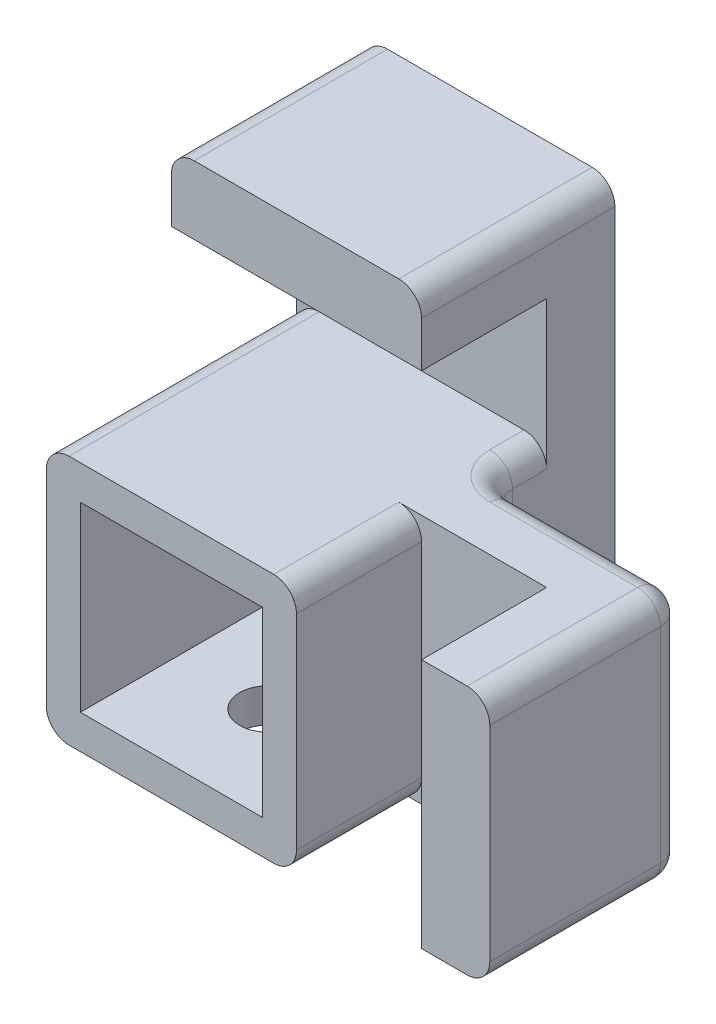
ISO-10303-21;
HEADER;
FILE_DESCRIPTION(('STEP AP214'),'2;1');
FILE_NAME('part.step','',(''),(''),'','','');
FILE_SCHEMA(('AUTOMOTIVE_DESIGN { 1 0 10303 214 1 1 1 1 }'));
ENDSEC;
DATA;
#1=APPLICATION_CONTEXT('core data for automotive mechanical design processes');
#2=APPLICATION_PROTOCOL_DEFINITION('international standard','automotive_design',2000,#1);
#3=PRODUCT_CONTEXT('',#1,'mechanical');
#4=PRODUCT('Part','Part','',(#3));
#5=PRODUCT_RELATED_PRODUCT_CATEGORY('part','',(#4));
#6=PRODUCT_DEFINITION_FORMATION('','',#4);
#7=PRODUCT_DEFINITION_CONTEXT('part definition',#1,'design');
#8=PRODUCT_DEFINITION('design','',#6,#7);
#9=PRODUCT_DEFINITION_SHAPE('','',#8);
#10=(LENGTH_UNIT() NAMED_UNIT(*) SI_UNIT(.MILLI.,.METRE.));
#11=(NAMED_UNIT(*) PLANE_ANGLE_UNIT() SI_UNIT($,.RADIAN.));
#12=(NAMED_UNIT(*) SI_UNIT($,.STERADIAN.) SOLID_ANGLE_UNIT());
#13=UNCERTAINTY_MEASURE_WITH_UNIT(LENGTH_MEASURE(1.E-05),#10,'distance_accuracy_value','');
#14=(GEOMETRIC_REPRESENTATION_CONTEXT(3) GLOBAL_UNCERTAINTY_ASSIGNED_CONTEXT((#13)) GLOBAL_UNIT_ASSIGNED_CONTEXT((#10,
#11,#12)) REPRESENTATION_CONTEXT('',''));
#15=CARTESIAN_POINT('',(0.,0.,0.));
#16=DIRECTION('',(0.,0.,1.));
#17=DIRECTION('',(1.,0.,0.));
#18=AXIS2_PLACEMENT_3D('',#15,#16,#17);
#19=CARTESIAN_POINT('',(-3.,19.,28.));
#20=DIRECTION('',(0.,-1.,0.));
#21=DIRECTION('',(0.,0.,-1.));
#22=AXIS2_PLACEMENT_3D('',#19,#20,#21);
#23=PLANE('',#22);
#24=DIRECTION('',(1.,0.,0.));
#25=VECTOR('',#24,1.);
#26=CARTESIAN_POINT('',(17.,19.,13.));
#27=LINE('',#26,#25);
#28=CARTESIAN_POINT('',(34.,19.,13.));
#29=VERTEX_POINT('',#28);
#30=CARTESIAN_POINT('',(21.,19.,13.));
#31=VERTEX_POINT('',#30);
#32=EDGE_CURVE('E452',#29,#31,#27,.F.);
#33=ORIENTED_EDGE('',*,*,#32,.T.);
#34=CARTESIAN_POINT('',(21.,19.,9.));
#35=DIRECTION('',(0.,-1.,0.));
#36=DIRECTION('',(0.,0.,-1.));
#37=AXIS2_PLACEMENT_3D('',#34,#35,#36);
#38=CIRCLE('',#37,4.);
#39=CARTESIAN_POINT('',(17.,19.,9.));
#40=VERTEX_POINT('',#39);
#41=EDGE_CURVE('E44',#31,#40,#38,.T.);
#42=ORIENTED_EDGE('',*,*,#41,.T.);
#43=DIRECTION('',(0.,0.,-1.));
#44=VECTOR('',#43,1.);
#45=CARTESIAN_POINT('',(17.,19.,28.));
#46=LINE('',#45,#44);
#47=CARTESIAN_POINT('',(17.,19.,6.));
#48=VERTEX_POINT('',#47);
#49=EDGE_CURVE('E386',#40,#48,#46,.T.);
#50=ORIENTED_EDGE('',*,*,#49,.T.);
#51=DIRECTION('',(1.,0.,0.));
#52=VECTOR('',#51,1.);
#53=CARTESIAN_POINT('',(-3.,19.,6.));
#54=LINE('',#53,#52);
#55=CARTESIAN_POINT('',(-1.,19.,6.));
#56=VERTEX_POINT('',#55);
#57=EDGE_CURVE('E277',#56,#48,#54,.T.);
#58=ORIENTED_EDGE('',*,*,#57,.F.);
#59=DIRECTION('',(0.,0.,-1.));
#60=VECTOR('',#59,1.);
#61=CARTESIAN_POINT('',(-1.,19.,28.));
#62=LINE('',#61,#60);
#63=CARTESIAN_POINT('',(-1.,19.,28.));
#64=VERTEX_POINT('',#63);
#65=EDGE_CURVE('E381',#56,#64,#62,.F.);
#66=ORIENTED_EDGE('',*,*,#65,.T.);
#67=DIRECTION('',(-1.,0.,0.));
#68=VECTOR('',#67,1.);
#69=CARTESIAN_POINT('',(-3.,19.,28.));
#70=LINE('',#69,#68);
#71=CARTESIAN_POINT('',(17.,19.,28.));
#72=VERTEX_POINT('',#71);
#73=EDGE_CURVE('E352',#72,#64,#70,.T.);
#74=ORIENTED_EDGE('',*,*,#73,.F.);
#75=DIRECTION('',(0.,0.,-1.));
#76=VECTOR('',#75,1.);
#77=CARTESIAN_POINT('',(17.,19.,28.));
#78=LINE('',#77,#76);
#79=CARTESIAN_POINT('',(17.,19.,17.));
#80=VERTEX_POINT('',#79);
#81=EDGE_CURVE('E383',#72,#80,#78,.T.);
#82=ORIENTED_EDGE('',*,*,#81,.T.);
#83=DIRECTION('',(-1.,0.,0.));
#84=VECTOR('',#83,1.);
#85=CARTESIAN_POINT('',(30.,19.,17.));
#86=LINE('',#85,#84);
#87=CARTESIAN_POINT('',(30.,19.,17.));
#88=VERTEX_POINT('',#87);
#89=EDGE_CURVE('E292',#88,#80,#86,.T.);
#90=ORIENTED_EDGE('',*,*,#89,.F.);
#91=DIRECTION('',(0.,0.,-1.));
#92=VECTOR('',#91,1.);
#93=CARTESIAN_POINT('',(30.,19.,28.));
#94=LINE('',#93,#92);
#95=CARTESIAN_POINT('',(30.,19.,28.));
#96=VERTEX_POINT('',#95);
#97=EDGE_CURVE('E288',#96,#88,#94,.T.);
#98=ORIENTED_EDGE('',*,*,#97,.F.);
#99=DIRECTION('',(-1.,0.,0.));
#100=VECTOR('',#99,1.);
#101=CARTESIAN_POINT('',(36.,19.,28.));
#102=LINE('',#101,#100);
#103=CARTESIAN_POINT('',(34.,19.,28.));
#104=VERTEX_POINT('',#103);
#105=EDGE_CURVE('E286',#104,#96,#102,.T.);
#106=ORIENTED_EDGE('',*,*,#105,.F.);
#107=DIRECTION('',(0.,0.,1.));
#108=VECTOR('',#107,1.);
#109=CARTESIAN_POINT('',(34.,19.,11.));
#110=LINE('',#109,#108);
#111=EDGE_CURVE('E388',#104,#29,#110,.F.);
#112=ORIENTED_EDGE('',*,*,#111,.T.);
#113=EDGE_LOOP('',(#33,#42,#50,#58,#66,#74,#82,#90,#98,#106,#112));
#114=FACE_BOUND('',#113,.T.);
#115=ADVANCED_FACE('F35',(#114),#23,.F.);
#116=CARTESIAN_POINT('',(19.,19.,28.));
#117=DIRECTION('',(-1.,0.,0.));
#118=DIRECTION('',(0.,-1.,0.));
#119=AXIS2_PLACEMENT_3D('',#116,#117,#118);
#120=PLANE('',#119);
#121=DIRECTION('',(0.,-1.,0.));
#122=VECTOR('',#121,1.);
#123=CARTESIAN_POINT('',(19.,19.,17.));
#124=LINE('',#123,#122);
#125=CARTESIAN_POINT('',(19.,17.,17.));
#126=VERTEX_POINT('',#125);
#127=CARTESIAN_POINT('',(19.,-0.999999999999997,17.));
#128=VERTEX_POINT('',#127);
#129=EDGE_CURVE('E300',#126,#128,#124,.T.);
#130=ORIENTED_EDGE('',*,*,#129,.F.);
#131=DIRECTION('',(0.,0.,-1.));
#132=VECTOR('',#131,1.);
#133=CARTESIAN_POINT('',(19.,17.,28.));
#134=LINE('',#133,#132);
#135=CARTESIAN_POINT('',(19.,17.,28.));
#136=VERTEX_POINT('',#135);
#137=EDGE_CURVE('E423',#126,#136,#134,.F.);
#138=ORIENTED_EDGE('',*,*,#137,.T.);
#139=DIRECTION('',(0.,1.,0.));
#140=VECTOR('',#139,1.);
#141=CARTESIAN_POINT('',(19.,19.,28.));
#142=LINE('',#141,#140);
#143=CARTESIAN_POINT('',(19.,-0.999999999999997,28.));
#144=VERTEX_POINT('',#143);
#145=EDGE_CURVE('E349',#144,#136,#142,.T.);
#146=ORIENTED_EDGE('',*,*,#145,.F.);
#147=DIRECTION('',(0.,0.,-1.));
#148=VECTOR('',#147,1.);
#149=CARTESIAN_POINT('',(19.,-0.999999999999997,28.));
#150=LINE('',#149,#148);
#151=EDGE_CURVE('E420',#144,#128,#150,.T.);
#152=ORIENTED_EDGE('',*,*,#151,.T.);
#153=EDGE_LOOP('',(#130,#138,#146,#152));
#154=FACE_BOUND('',#153,.T.);
#155=ADVANCED_FACE('F526',(#154),#120,.F.);
#156=CARTESIAN_POINT('',(0.,0.,28.));
#157=DIRECTION('',(0.,0.,1.));
#158=DIRECTION('',(1.,0.,0.));
#159=AXIS2_PLACEMENT_3D('',#156,#157,#158);
#160=PLANE('',#159);
#161=ORIENTED_EDGE('',*,*,#145,.T.);
#162=CARTESIAN_POINT('',(17.,17.,28.));
#163=DIRECTION('',(0.,0.,1.));
#164=DIRECTION('',(1.,0.,0.));
#165=AXIS2_PLACEMENT_3D('',#162,#163,#164);
#166=CIRCLE('',#165,2.);
#167=EDGE_CURVE('E431',#136,#72,#166,.T.);
#168=ORIENTED_EDGE('',*,*,#167,.T.);
#169=ORIENTED_EDGE('',*,*,#73,.T.);
#170=CARTESIAN_POINT('',(-1.,17.,28.));
#171=DIRECTION('',(0.,0.,1.));
#172=DIRECTION('',(1.,0.,0.));
#173=AXIS2_PLACEMENT_3D('',#170,#171,#172);
#174=CIRCLE('',#173,2.);
#175=CARTESIAN_POINT('',(-3.,17.,28.));
#176=VERTEX_POINT('',#175);
#177=EDGE_CURVE('E427',#64,#176,#174,.T.);
#178=ORIENTED_EDGE('',*,*,#177,.T.);
#179=DIRECTION('',(0.,-1.,0.));
#180=VECTOR('',#179,1.);
#181=CARTESIAN_POINT('',(-3.,19.,28.));
#182=LINE('',#181,#180);
#183=CARTESIAN_POINT('',(-3.00000000000001,-0.999999999999997,28.));
#184=VERTEX_POINT('',#183);
#185=EDGE_CURVE('E342',#176,#184,#182,.T.);
#186=ORIENTED_EDGE('',*,*,#185,.T.);
#187=CARTESIAN_POINT('',(-1.00000000000001,-0.999999999999999,28.));
#188=DIRECTION('',(0.,0.,1.));
#189=DIRECTION('',(1.,0.,0.));
#190=AXIS2_PLACEMENT_3D('',#187,#188,#189);
#191=CIRCLE('',#190,2.);
#192=CARTESIAN_POINT('',(-1.00000000000001,-3.,28.));
#193=VERTEX_POINT('',#192);
#194=EDGE_CURVE('E425',#184,#193,#191,.T.);
#195=ORIENTED_EDGE('',*,*,#194,.T.);
#196=DIRECTION('',(1.,0.,0.));
#197=VECTOR('',#196,1.);
#198=CARTESIAN_POINT('',(-3.00000000000001,-3.,28.));
#199=LINE('',#198,#197);
#200=CARTESIAN_POINT('',(17.,-3.,28.));
#201=VERTEX_POINT('',#200);
#202=EDGE_CURVE('E345',#193,#201,#199,.T.);
#203=ORIENTED_EDGE('',*,*,#202,.T.);
#204=CARTESIAN_POINT('',(17.,-0.999999999999997,28.));
#205=DIRECTION('',(0.,0.,1.));
#206=DIRECTION('',(1.,0.,0.));
#207=AXIS2_PLACEMENT_3D('',#204,#205,#206);
#208=CIRCLE('',#207,2.);
#209=EDGE_CURVE('E429',#201,#144,#208,.T.);
#210=ORIENTED_EDGE('',*,*,#209,.T.);
#211=EDGE_LOOP('',(#161,#168,#169,#178,#186,#195,#203,#210));
#212=FACE_BOUND('',#211,.T.);
#213=DIRECTION('',(1.,0.,0.));
#214=VECTOR('',#213,1.);
#215=CARTESIAN_POINT('',(0.,0.,28.));
#216=LINE('',#215,#214);
#217=CARTESIAN_POINT('',(0.,0.,28.));
#218=VERTEX_POINT('',#217);
#219=CARTESIAN_POINT('',(16.,0.,28.));
#220=VERTEX_POINT('',#219);
#221=EDGE_CURVE('E313',#218,#220,#216,.T.);
#222=ORIENTED_EDGE('',*,*,#221,.F.);
#223=DIRECTION('',(0.,-1.,0.));
#224=VECTOR('',#223,1.);
#225=CARTESIAN_POINT('',(0.,0.,28.));
#226=LINE('',#225,#224);
#227=CARTESIAN_POINT('',(0.,16.,28.));
#228=VERTEX_POINT('',#227);
#229=EDGE_CURVE('E311',#228,#218,#226,.T.);
#230=ORIENTED_EDGE('',*,*,#229,.F.);
#231=DIRECTION('',(-1.,0.,0.));
#232=VECTOR('',#231,1.);
#233=CARTESIAN_POINT('',(0.,16.,28.));
#234=LINE('',#233,#232);
#235=CARTESIAN_POINT('',(16.,16.,28.));
#236=VERTEX_POINT('',#235);
#237=EDGE_CURVE('E319',#236,#228,#234,.T.);
#238=ORIENTED_EDGE('',*,*,#237,.F.);
#239=DIRECTION('',(0.,1.,0.));
#240=VECTOR('',#239,1.);
#241=CARTESIAN_POINT('',(16.,0.,28.));
#242=LINE('',#241,#240);
#243=EDGE_CURVE('E316',#220,#236,#242,.T.);
#244=ORIENTED_EDGE('',*,*,#243,.F.);
#245=EDGE_LOOP('',(#222,#230,#238,#244));
#246=FACE_BOUND('',#245,.T.);
#247=ADVANCED_FACE('F521',(#212,#246),#160,.T.);
#248=CARTESIAN_POINT('',(0.,0.,0.));
#249=DIRECTION('',(0.,0.,1.));
#250=DIRECTION('',(1.,0.,0.));
#251=AXIS2_PLACEMENT_3D('',#248,#249,#250);
#252=PLANE('',#251);
#253=DIRECTION('',(1.,0.,0.));
#254=VECTOR('',#253,1.);
#255=CARTESIAN_POINT('',(-3.,36.,0.));
#256=LINE('',#255,#254);
#257=CARTESIAN_POINT('',(-0.999999999999997,36.,0.));
#258=VERTEX_POINT('',#257);
#259=CARTESIAN_POINT('',(17.,36.,0.));
#260=VERTEX_POINT('',#259);
#261=EDGE_CURVE('E268',#258,#260,#256,.T.);
#262=ORIENTED_EDGE('',*,*,#261,.T.);
#263=CARTESIAN_POINT('',(17.,34.,0.));
#264=DIRECTION('',(0.,0.,1.));
#265=DIRECTION('',(1.,0.,0.));
#266=AXIS2_PLACEMENT_3D('',#263,#264,#265);
#267=CIRCLE('',#266,2.);
#268=CARTESIAN_POINT('',(19.,34.,0.));
#269=VERTEX_POINT('',#268);
#270=EDGE_CURVE('E412',#260,#269,#267,.F.);
#271=ORIENTED_EDGE('',*,*,#270,.T.);
#272=DIRECTION('',(0.,1.,0.));
#273=VECTOR('',#272,1.);
#274=CARTESIAN_POINT('',(19.,19.,0.));
#275=LINE('',#274,#273);
#276=CARTESIAN_POINT('',(19.,-0.999999999999997,0.));
#277=VERTEX_POINT('',#276);
#278=EDGE_CURVE('E346',#277,#269,#275,.T.);
#279=ORIENTED_EDGE('',*,*,#278,.F.);
#280=CARTESIAN_POINT('',(17.,-0.999999999999997,0.));
#281=DIRECTION('',(0.,0.,1.));
#282=DIRECTION('',(1.,0.,0.));
#283=AXIS2_PLACEMENT_3D('',#280,#281,#282);
#284=CIRCLE('',#283,2.);
#285=CARTESIAN_POINT('',(17.,-3.,0.));
#286=VERTEX_POINT('',#285);
#287=EDGE_CURVE('E408',#277,#286,#284,.F.);
#288=ORIENTED_EDGE('',*,*,#287,.T.);
#289=DIRECTION('',(1.,0.,0.));
#290=VECTOR('',#289,1.);
#291=CARTESIAN_POINT('',(-3.00000000000001,-3.,0.));
#292=LINE('',#291,#290);
#293=CARTESIAN_POINT('',(-1.00000000000001,-3.,0.));
#294=VERTEX_POINT('',#293);
#295=EDGE_CURVE('E358',#294,#286,#292,.T.);
#296=ORIENTED_EDGE('',*,*,#295,.F.);
#297=CARTESIAN_POINT('',(-1.00000000000001,-0.999999999999999,0.));
#298=DIRECTION('',(0.,0.,1.));
#299=DIRECTION('',(1.,0.,0.));
#300=AXIS2_PLACEMENT_3D('',#297,#298,#299);
#301=CIRCLE('',#300,2.);
#302=CARTESIAN_POINT('',(-3.00000000000001,-0.999999999999997,0.));
#303=VERTEX_POINT('',#302);
#304=EDGE_CURVE('E406',#294,#303,#301,.F.);
#305=ORIENTED_EDGE('',*,*,#304,.T.);
#306=DIRECTION('',(0.,-1.,0.));
#307=VECTOR('',#306,1.);
#308=CARTESIAN_POINT('',(-3.,19.,0.));
#309=LINE('',#308,#307);
#310=CARTESIAN_POINT('',(-3.,34.,0.));
#311=VERTEX_POINT('',#310);
#312=EDGE_CURVE('E341',#311,#303,#309,.T.);
#313=ORIENTED_EDGE('',*,*,#312,.F.);
#314=CARTESIAN_POINT('',(-0.999999999999998,34.,0.));
#315=DIRECTION('',(0.,0.,1.));
#316=DIRECTION('',(1.,0.,0.));
#317=AXIS2_PLACEMENT_3D('',#314,#315,#316);
#318=CIRCLE('',#317,2.);
#319=EDGE_CURVE('E410',#311,#258,#318,.F.);
#320=ORIENTED_EDGE('',*,*,#319,.T.);
#321=EDGE_LOOP('',(#262,#271,#279,#288,#296,#305,#313,#320));
#322=FACE_BOUND('',#321,.T.);
#323=DIRECTION('',(0.,-1.,0.));
#324=VECTOR('',#323,1.);
#325=CARTESIAN_POINT('',(0.,0.,0.));
#326=LINE('',#325,#324);
#327=CARTESIAN_POINT('',(0.,16.,0.));
#328=VERTEX_POINT('',#327);
#329=CARTESIAN_POINT('',(0.,0.,0.));
#330=VERTEX_POINT('',#329);
#331=EDGE_CURVE('E303',#328,#330,#326,.T.);
#332=ORIENTED_EDGE('',*,*,#331,.T.);
#333=DIRECTION('',(1.,0.,0.));
#334=VECTOR('',#333,1.);
#335=CARTESIAN_POINT('',(0.,0.,0.));
#336=LINE('',#335,#334);
#337=CARTESIAN_POINT('',(16.,0.,0.));
#338=VERTEX_POINT('',#337);
#339=EDGE_CURVE('E324',#330,#338,#336,.T.);
#340=ORIENTED_EDGE('',*,*,#339,.T.);
#341=DIRECTION('',(0.,1.,0.));
#342=VECTOR('',#341,1.);
#343=CARTESIAN_POINT('',(16.,0.,0.));
#344=LINE('',#343,#342);
#345=CARTESIAN_POINT('',(16.,16.,0.));
#346=VERTEX_POINT('',#345);
#347=EDGE_CURVE('E327',#338,#346,#344,.T.);
#348=ORIENTED_EDGE('',*,*,#347,.T.);
#349=DIRECTION('',(-1.,0.,0.));
#350=VECTOR('',#349,1.);
#351=CARTESIAN_POINT('',(0.,16.,0.));
#352=LINE('',#351,#350);
#353=EDGE_CURVE('E314',#346,#328,#352,.T.);
#354=ORIENTED_EDGE('',*,*,#353,.T.);
#355=EDGE_LOOP('',(#332,#340,#348,#354));
#356=FACE_BOUND('',#355,.T.);
#357=ADVANCED_FACE('F512',(#322,#356),#252,.F.);
#358=CARTESIAN_POINT('',(-3.,19.,28.));
#359=DIRECTION('',(1.,0.,0.));
#360=DIRECTION('',(0.,1.,0.));
#361=AXIS2_PLACEMENT_3D('',#358,#359,#360);
#362=PLANE('',#361);
#363=CARTESIAN_POINT('',(-3.00000000000001,8.00000000000001,5.5));
#364=DIRECTION('',(-1.,0.,0.));
#365=DIRECTION('',(0.,-1.,0.));
#366=AXIS2_PLACEMENT_3D('',#363,#364,#365);
#367=CIRCLE('',#366,2.5);
#368=CARTESIAN_POINT('',(-3.00000000000001,5.50000000000001,5.5));
#369=VERTEX_POINT('',#368);
#370=EDGE_CURVE('E274',#369,#369,#367,.T.);
#371=ORIENTED_EDGE('',*,*,#370,.F.);
#372=EDGE_LOOP('',(#371));
#373=FACE_BOUND('',#372,.T.);
#374=DIRECTION('',(0.,-1.,0.));
#375=VECTOR('',#374,1.);
#376=CARTESIAN_POINT('',(-3.,30.,17.));
#377=LINE('',#376,#375);
#378=CARTESIAN_POINT('',(-3.,34.,17.));
#379=VERTEX_POINT('',#378);
#380=CARTESIAN_POINT('',(-3.,30.,17.));
#381=VERTEX_POINT('',#380);
#382=EDGE_CURVE('E241',#379,#381,#377,.T.);
#383=ORIENTED_EDGE('',*,*,#382,.F.);
#384=DIRECTION('',(0.,0.,1.));
#385=VECTOR('',#384,1.);
#386=CARTESIAN_POINT('',(-3.,34.,0.));
#387=LINE('',#386,#385);
#388=EDGE_CURVE('E418',#379,#311,#387,.F.);
#389=ORIENTED_EDGE('',*,*,#388,.T.);
#390=ORIENTED_EDGE('',*,*,#312,.T.);
#391=DIRECTION('',(0.,0.,-1.));
#392=VECTOR('',#391,1.);
#393=CARTESIAN_POINT('',(-3.00000000000001,-0.999999999999997,28.));
#394=LINE('',#393,#392);
#395=EDGE_CURVE('E414',#303,#184,#394,.F.);
#396=ORIENTED_EDGE('',*,*,#395,.T.);
#397=ORIENTED_EDGE('',*,*,#185,.F.);
#398=DIRECTION('',(0.,0.,-1.));
#399=VECTOR('',#398,1.);
#400=CARTESIAN_POINT('',(-3.,17.,28.));
#401=LINE('',#400,#399);
#402=CARTESIAN_POINT('',(-3.,17.,6.));
#403=VERTEX_POINT('',#402);
#404=EDGE_CURVE('E416',#176,#403,#401,.T.);
#405=ORIENTED_EDGE('',*,*,#404,.T.);
#406=DIRECTION('',(0.,-1.,0.));
#407=VECTOR('',#406,1.);
#408=CARTESIAN_POINT('',(-3.,19.,6.));
#409=LINE('',#408,#407);
#410=CARTESIAN_POINT('',(-3.,30.,6.));
#411=VERTEX_POINT('',#410);
#412=EDGE_CURVE('E266',#411,#403,#409,.T.);
#413=ORIENTED_EDGE('',*,*,#412,.F.);
#414=DIRECTION('',(0.,0.,-1.));
#415=VECTOR('',#414,1.);
#416=CARTESIAN_POINT('',(-3.,30.,6.));
#417=LINE('',#416,#415);
#418=EDGE_CURVE('E252',#381,#411,#417,.T.);
#419=ORIENTED_EDGE('',*,*,#418,.F.);
#420=EDGE_LOOP('',(#383,#389,#390,#396,#397,#405,#413,#419));
#421=FACE_BOUND('',#420,.T.);
#422=ADVANCED_FACE('F264',(#373,#421),#362,.F.);
#423=CARTESIAN_POINT('',(-3.00000000000001,-3.,28.));
#424=DIRECTION('',(0.,1.,0.));
#425=DIRECTION('',(0.,0.,1.));
#426=AXIS2_PLACEMENT_3D('',#423,#424,#425);
#427=PLANE('',#426);
#428=CARTESIAN_POINT('',(8.,-3.,19.5));
#429=DIRECTION('',(0.,-1.,0.));
#430=DIRECTION('',(0.,0.,-1.));
#431=AXIS2_PLACEMENT_3D('',#428,#429,#430);
#432=CIRCLE('',#431,2.5);
#433=CARTESIAN_POINT('',(8.,-3.,17.));
#434=VERTEX_POINT('',#433);
#435=EDGE_CURVE('E496',#434,#434,#432,.T.);
#436=ORIENTED_EDGE('',*,*,#435,.F.);
#437=EDGE_LOOP('',(#436));
#438=FACE_BOUND('',#437,.T.);
#439=DIRECTION('',(0.,0.,-1.));
#440=VECTOR('',#439,1.);
#441=CARTESIAN_POINT('',(17.,-3.,28.));
#442=LINE('',#441,#440);
#443=CARTESIAN_POINT('',(17.,-3.,9.));
#444=VERTEX_POINT('',#443);
#445=EDGE_CURVE('E365',#286,#444,#442,.F.);
#446=ORIENTED_EDGE('',*,*,#445,.T.);
#447=CARTESIAN_POINT('',(21.,-3.,9.));
#448=DIRECTION('',(0.,1.,0.));
#449=DIRECTION('',(0.,0.,1.));
#450=AXIS2_PLACEMENT_3D('',#447,#448,#449);
#451=CIRCLE('',#450,4.);
#452=CARTESIAN_POINT('',(21.,-3.,13.));
#453=VERTEX_POINT('',#452);
#454=EDGE_CURVE('E11',#444,#453,#451,.T.);
#455=ORIENTED_EDGE('',*,*,#454,.T.);
#456=DIRECTION('',(1.,0.,0.));
#457=VECTOR('',#456,1.);
#458=CARTESIAN_POINT('',(34.,-3.,13.));
#459=LINE('',#458,#457);
#460=CARTESIAN_POINT('',(34.,-3.,13.));
#461=VERTEX_POINT('',#460);
#462=EDGE_CURVE('E457',#453,#461,#459,.T.);
#463=ORIENTED_EDGE('',*,*,#462,.T.);
#464=DIRECTION('',(0.,0.,1.));
#465=VECTOR('',#464,1.);
#466=CARTESIAN_POINT('',(34.,-3.,28.));
#467=LINE('',#466,#465);
#468=CARTESIAN_POINT('',(34.,-3.,28.));
#469=VERTEX_POINT('',#468);
#470=EDGE_CURVE('E370',#461,#469,#467,.T.);
#471=ORIENTED_EDGE('',*,*,#470,.T.);
#472=DIRECTION('',(-1.,0.,0.));
#473=VECTOR('',#472,1.);
#474=CARTESIAN_POINT('',(36.,-3.,28.));
#475=LINE('',#474,#473);
#476=CARTESIAN_POINT('',(30.,-3.,28.));
#477=VERTEX_POINT('',#476);
#478=EDGE_CURVE('E280',#469,#477,#475,.T.);
#479=ORIENTED_EDGE('',*,*,#478,.T.);
#480=DIRECTION('',(0.,0.,-1.));
#481=VECTOR('',#480,1.);
#482=CARTESIAN_POINT('',(30.,-3.,28.));
#483=LINE('',#482,#481);
#484=CARTESIAN_POINT('',(30.,-3.,17.));
#485=VERTEX_POINT('',#484);
#486=EDGE_CURVE('E296',#477,#485,#483,.T.);
#487=ORIENTED_EDGE('',*,*,#486,.T.);
#488=DIRECTION('',(-1.,0.,0.));
#489=VECTOR('',#488,1.);
#490=CARTESIAN_POINT('',(30.,-3.,17.));
#491=LINE('',#490,#489);
#492=CARTESIAN_POINT('',(17.,-3.,17.));
#493=VERTEX_POINT('',#492);
#494=EDGE_CURVE('E289',#485,#493,#491,.T.);
#495=ORIENTED_EDGE('',*,*,#494,.T.);
#496=DIRECTION('',(0.,0.,-1.));
#497=VECTOR('',#496,1.);
#498=CARTESIAN_POINT('',(17.,-3.,28.));
#499=LINE('',#498,#497);
#500=EDGE_CURVE('E368',#493,#201,#499,.F.);
#501=ORIENTED_EDGE('',*,*,#500,.T.);
#502=ORIENTED_EDGE('',*,*,#202,.F.);
#503=DIRECTION('',(0.,0.,-1.));
#504=VECTOR('',#503,1.);
#505=CARTESIAN_POINT('',(-1.00000000000001,-3.,28.));
#506=LINE('',#505,#504);
#507=EDGE_CURVE('E355',#193,#294,#506,.T.);
#508=ORIENTED_EDGE('',*,*,#507,.T.);
#509=ORIENTED_EDGE('',*,*,#295,.T.);
#510=EDGE_LOOP('',(#446,#455,#463,#471,#479,#487,#495,#501,#502,#508,#509));
#511=FACE_BOUND('',#510,.T.);
#512=ADVANCED_FACE('F511',(#438,#511),#427,.F.);
#513=DIRECTION('',(0.,0.,-1.));
#514=VECTOR('',#513,1.);
#515=CARTESIAN_POINT('',(19.,17.,28.));
#516=LINE('',#515,#514);
#517=CARTESIAN_POINT('',(19.,17.,6.));
#518=VERTEX_POINT('',#517);
#519=CARTESIAN_POINT('',(19.,17.,9.));
#520=VERTEX_POINT('',#519);
#521=EDGE_CURVE('E393',#518,#520,#516,.F.);
#522=ORIENTED_EDGE('',*,*,#521,.T.);
#523=DIRECTION('',(0.,-1.,0.));
#524=VECTOR('',#523,1.);
#525=CARTESIAN_POINT('',(19.,19.,9.));
#526=LINE('',#525,#524);
#527=CARTESIAN_POINT('',(19.,-0.999999999999997,9.));
#528=VERTEX_POINT('',#527);
#529=EDGE_CURVE('E52',#520,#528,#526,.T.);
#530=ORIENTED_EDGE('',*,*,#529,.T.);
#531=DIRECTION('',(0.,0.,-1.));
#532=VECTOR('',#531,1.);
#533=CARTESIAN_POINT('',(19.,-0.999999999999997,28.));
#534=LINE('',#533,#532);
#535=EDGE_CURVE('E391',#528,#277,#534,.T.);
#536=ORIENTED_EDGE('',*,*,#535,.T.);
#537=ORIENTED_EDGE('',*,*,#278,.T.);
#538=DIRECTION('',(0.,0.,1.));
#539=VECTOR('',#538,1.);
#540=CARTESIAN_POINT('',(19.,34.,17.));
#541=LINE('',#540,#539);
#542=CARTESIAN_POINT('',(19.,34.,17.));
#543=VERTEX_POINT('',#542);
#544=EDGE_CURVE('E395',#269,#543,#541,.T.);
#545=ORIENTED_EDGE('',*,*,#544,.T.);
#546=DIRECTION('',(0.,-1.,0.));
#547=VECTOR('',#546,1.);
#548=CARTESIAN_POINT('',(19.,30.,17.));
#549=LINE('',#548,#547);
#550=CARTESIAN_POINT('',(19.,30.,17.));
#551=VERTEX_POINT('',#550);
#552=EDGE_CURVE('E272',#543,#551,#549,.T.);
#553=ORIENTED_EDGE('',*,*,#552,.T.);
#554=DIRECTION('',(0.,0.,-1.));
#555=VECTOR('',#554,1.);
#556=CARTESIAN_POINT('',(19.,30.,6.));
#557=LINE('',#556,#555);
#558=CARTESIAN_POINT('',(19.,30.,6.));
#559=VERTEX_POINT('',#558);
#560=EDGE_CURVE('E260',#551,#559,#557,.T.);
#561=ORIENTED_EDGE('',*,*,#560,.T.);
#562=DIRECTION('',(0.,-1.,0.));
#563=VECTOR('',#562,1.);
#564=CARTESIAN_POINT('',(19.,19.,6.));
#565=LINE('',#564,#563);
#566=EDGE_CURVE('E253',#559,#518,#565,.T.);
#567=ORIENTED_EDGE('',*,*,#566,.T.);
#568=EDGE_LOOP('',(#522,#530,#536,#537,#545,#553,#561,#567));
#569=FACE_BOUND('',#568,.T.);
#570=ADVANCED_FACE('F518',(#569),#120,.F.);
#571=CARTESIAN_POINT('',(0.,0.,28.));
#572=DIRECTION('',(1.,0.,0.));
#573=DIRECTION('',(0.,0.,-1.));
#574=AXIS2_PLACEMENT_3D('',#571,#572,#573);
#575=PLANE('',#574);
#576=CARTESIAN_POINT('',(0.,8.00000000000001,5.5));
#577=DIRECTION('',(1.,0.,0.));
#578=DIRECTION('',(0.,0.,-1.));
#579=AXIS2_PLACEMENT_3D('',#576,#577,#578);
#580=CIRCLE('',#579,2.5);
#581=CARTESIAN_POINT('',(0.,8.00000000000001,3.));
#582=VERTEX_POINT('',#581);
#583=EDGE_CURVE('E501',#582,#582,#580,.F.);
#584=ORIENTED_EDGE('',*,*,#583,.T.);
#585=EDGE_LOOP('',(#584));
#586=FACE_BOUND('',#585,.T.);
#587=ORIENTED_EDGE('',*,*,#331,.F.);
#588=DIRECTION('',(0.,0.,-1.));
#589=VECTOR('',#588,1.);
#590=CARTESIAN_POINT('',(0.,16.,28.));
#591=LINE('',#590,#589);
#592=EDGE_CURVE('E321',#228,#328,#591,.T.);
#593=ORIENTED_EDGE('',*,*,#592,.F.);
#594=ORIENTED_EDGE('',*,*,#229,.T.);
#595=DIRECTION('',(0.,0.,-1.));
#596=VECTOR('',#595,1.);
#597=CARTESIAN_POINT('',(0.,0.,28.));
#598=LINE('',#597,#596);
#599=EDGE_CURVE('E338',#218,#330,#598,.T.);
#600=ORIENTED_EDGE('',*,*,#599,.T.);
#601=EDGE_LOOP('',(#587,#593,#594,#600));
#602=FACE_BOUND('',#601,.T.);
#603=ADVANCED_FACE('F536',(#586,#602),#575,.T.);
#604=CARTESIAN_POINT('',(0.,0.,28.));
#605=DIRECTION('',(0.,1.,0.));
#606=DIRECTION('',(0.,0.,1.));
#607=AXIS2_PLACEMENT_3D('',#604,#605,#606);
#608=PLANE('',#607);
#609=CARTESIAN_POINT('',(8.,0.,19.5));
#610=DIRECTION('',(0.,1.,0.));
#611=DIRECTION('',(0.,0.,1.));
#612=AXIS2_PLACEMENT_3D('',#609,#610,#611);
#613=CIRCLE('',#612,2.5);
#614=CARTESIAN_POINT('',(8.,0.,22.));
#615=VERTEX_POINT('',#614);
#616=EDGE_CURVE('E490',#615,#615,#613,.F.);
#617=ORIENTED_EDGE('',*,*,#616,.T.);
#618=EDGE_LOOP('',(#617));
#619=FACE_BOUND('',#618,.T.);
#620=ORIENTED_EDGE('',*,*,#339,.F.);
#621=ORIENTED_EDGE('',*,*,#599,.F.);
#622=ORIENTED_EDGE('',*,*,#221,.T.);
#623=DIRECTION('',(0.,0.,-1.));
#624=VECTOR('',#623,1.);
#625=CARTESIAN_POINT('',(16.,0.,28.));
#626=LINE('',#625,#624);
#627=EDGE_CURVE('E336',#220,#338,#626,.T.);
#628=ORIENTED_EDGE('',*,*,#627,.T.);
#629=EDGE_LOOP('',(#620,#621,#622,#628));
#630=FACE_BOUND('',#629,.T.);
#631=ADVANCED_FACE('F540',(#619,#630),#608,.T.);
#632=CARTESIAN_POINT('',(16.,0.,28.));
#633=DIRECTION('',(-1.,0.,0.));
#634=DIRECTION('',(0.,0.,1.));
#635=AXIS2_PLACEMENT_3D('',#632,#633,#634);
#636=PLANE('',#635);
#637=ORIENTED_EDGE('',*,*,#347,.F.);
#638=ORIENTED_EDGE('',*,*,#627,.F.);
#639=ORIENTED_EDGE('',*,*,#243,.T.);
#640=DIRECTION('',(0.,0.,-1.));
#641=VECTOR('',#640,1.);
#642=CARTESIAN_POINT('',(16.,16.,28.));
#643=LINE('',#642,#641);
#644=EDGE_CURVE('E334',#236,#346,#643,.T.);
#645=ORIENTED_EDGE('',*,*,#644,.T.);
#646=EDGE_LOOP('',(#637,#638,#639,#645));
#647=FACE_BOUND('',#646,.T.);
#648=ADVANCED_FACE('F669',(#647),#636,.T.);
#649=CARTESIAN_POINT('',(0.,16.,28.));
#650=DIRECTION('',(0.,-1.,0.));
#651=DIRECTION('',(0.,0.,-1.));
#652=AXIS2_PLACEMENT_3D('',#649,#650,#651);
#653=PLANE('',#652);
#654=ORIENTED_EDGE('',*,*,#353,.F.);
#655=ORIENTED_EDGE('',*,*,#644,.F.);
#656=ORIENTED_EDGE('',*,*,#237,.T.);
#657=ORIENTED_EDGE('',*,*,#592,.T.);
#658=EDGE_LOOP('',(#654,#655,#656,#657));
#659=FACE_BOUND('',#658,.T.);
#660=ADVANCED_FACE('F659',(#659),#653,.T.);
#661=CARTESIAN_POINT('',(30.,19.,17.));
#662=DIRECTION('',(0.,0.,1.));
#663=DIRECTION('',(1.,0.,0.));
#664=AXIS2_PLACEMENT_3D('',#661,#662,#663);
#665=PLANE('',#664);
#666=ORIENTED_EDGE('',*,*,#494,.F.);
#667=DIRECTION('',(0.,-1.,0.));
#668=VECTOR('',#667,1.);
#669=CARTESIAN_POINT('',(30.,19.,17.));
#670=LINE('',#669,#668);
#671=EDGE_CURVE('E304',#88,#485,#670,.T.);
#672=ORIENTED_EDGE('',*,*,#671,.F.);
#673=ORIENTED_EDGE('',*,*,#89,.T.);
#674=CARTESIAN_POINT('',(17.,17.,17.));
#675=DIRECTION('',(0.,0.,1.));
#676=DIRECTION('',(1.,0.,0.));
#677=AXIS2_PLACEMENT_3D('',#674,#675,#676);
#678=CIRCLE('',#677,2.);
#679=EDGE_CURVE('E436',#80,#126,#678,.F.);
#680=ORIENTED_EDGE('',*,*,#679,.T.);
#681=ORIENTED_EDGE('',*,*,#129,.T.);
#682=CARTESIAN_POINT('',(17.,-0.999999999999997,17.));
#683=DIRECTION('',(0.,0.,1.));
#684=DIRECTION('',(1.,0.,0.));
#685=AXIS2_PLACEMENT_3D('',#682,#683,#684);
#686=CIRCLE('',#685,2.);
#687=EDGE_CURVE('E438',#128,#493,#686,.F.);
#688=ORIENTED_EDGE('',*,*,#687,.T.);
#689=EDGE_LOOP('',(#666,#672,#673,#680,#681,#688));
#690=FACE_BOUND('',#689,.T.);
#691=ADVANCED_FACE('F649',(#690),#665,.T.);
#692=CARTESIAN_POINT('',(30.,19.,28.));
#693=DIRECTION('',(-1.,0.,0.));
#694=DIRECTION('',(0.,0.,1.));
#695=AXIS2_PLACEMENT_3D('',#692,#693,#694);
#696=PLANE('',#695);
#697=ORIENTED_EDGE('',*,*,#486,.F.);
#698=DIRECTION('',(0.,-1.,0.));
#699=VECTOR('',#698,1.);
#700=CARTESIAN_POINT('',(30.,19.,28.));
#701=LINE('',#700,#699);
#702=EDGE_CURVE('E306',#96,#477,#701,.T.);
#703=ORIENTED_EDGE('',*,*,#702,.F.);
#704=ORIENTED_EDGE('',*,*,#97,.T.);
#705=ORIENTED_EDGE('',*,*,#671,.T.);
#706=EDGE_LOOP('',(#697,#703,#704,#705));
#707=FACE_BOUND('',#706,.T.);
#708=ADVANCED_FACE('F651',(#707),#696,.T.);
#709=CARTESIAN_POINT('',(36.,19.,28.));
#710=DIRECTION('',(0.,0.,1.));
#711=DIRECTION('',(1.,0.,0.));
#712=AXIS2_PLACEMENT_3D('',#709,#710,#711);
#713=PLANE('',#712);
#714=ORIENTED_EDGE('',*,*,#478,.F.);
#715=CARTESIAN_POINT('',(34.,-0.999999999999999,28.));
#716=DIRECTION('',(0.,0.,1.));
#717=DIRECTION('',(1.,0.,0.));
#718=AXIS2_PLACEMENT_3D('',#715,#716,#717);
#719=CIRCLE('',#718,2.);
#720=CARTESIAN_POINT('',(36.,-0.999999999999997,28.));
#721=VERTEX_POINT('',#720);
#722=EDGE_CURVE('E374',#469,#721,#719,.T.);
#723=ORIENTED_EDGE('',*,*,#722,.T.);
#724=DIRECTION('',(0.,-1.,0.));
#725=VECTOR('',#724,1.);
#726=CARTESIAN_POINT('',(36.,19.,28.));
#727=LINE('',#726,#725);
#728=CARTESIAN_POINT('',(36.,17.,28.));
#729=VERTEX_POINT('',#728);
#730=EDGE_CURVE('E294',#729,#721,#727,.T.);
#731=ORIENTED_EDGE('',*,*,#730,.F.);
#732=CARTESIAN_POINT('',(34.,17.,28.));
#733=DIRECTION('',(0.,0.,1.));
#734=DIRECTION('',(1.,0.,0.));
#735=AXIS2_PLACEMENT_3D('',#732,#733,#734);
#736=CIRCLE('',#735,2.);
#737=EDGE_CURVE('E372',#729,#104,#736,.T.);
#738=ORIENTED_EDGE('',*,*,#737,.T.);
#739=ORIENTED_EDGE('',*,*,#105,.T.);
#740=ORIENTED_EDGE('',*,*,#702,.T.);
#741=EDGE_LOOP('',(#714,#723,#731,#738,#739,#740));
#742=FACE_BOUND('',#741,.T.);
#743=ADVANCED_FACE('F644',(#742),#713,.T.);
#744=CARTESIAN_POINT('',(36.,19.,11.));
#745=DIRECTION('',(1.,0.,0.));
#746=DIRECTION('',(0.,0.,-1.));
#747=AXIS2_PLACEMENT_3D('',#744,#745,#746);
#748=PLANE('',#747);
#749=DIRECTION('',(0.,0.,1.));
#750=VECTOR('',#749,1.);
#751=CARTESIAN_POINT('',(36.,-0.999999999999999,11.));
#752=LINE('',#751,#750);
#753=CARTESIAN_POINT('',(36.,-0.999999999999999,13.));
#754=VERTEX_POINT('',#753);
#755=EDGE_CURVE('E378',#721,#754,#752,.F.);
#756=ORIENTED_EDGE('',*,*,#755,.T.);
#757=DIRECTION('',(0.,-1.,0.));
#758=VECTOR('',#757,1.);
#759=CARTESIAN_POINT('',(36.,19.,13.));
#760=LINE('',#759,#758);
#761=CARTESIAN_POINT('',(36.,17.,13.));
#762=VERTEX_POINT('',#761);
#763=EDGE_CURVE('E464',#754,#762,#760,.F.);
#764=ORIENTED_EDGE('',*,*,#763,.T.);
#765=DIRECTION('',(0.,0.,1.));
#766=VECTOR('',#765,1.);
#767=CARTESIAN_POINT('',(36.,17.,28.));
#768=LINE('',#767,#766);
#769=EDGE_CURVE('E376',#762,#729,#768,.T.);
#770=ORIENTED_EDGE('',*,*,#769,.T.);
#771=ORIENTED_EDGE('',*,*,#730,.T.);
#772=EDGE_LOOP('',(#756,#764,#770,#771));
#773=FACE_BOUND('',#772,.T.);
#774=ADVANCED_FACE('F638',(#773),#748,.T.);
#775=CARTESIAN_POINT('',(19.,19.,11.));
#776=DIRECTION('',(0.,0.,-1.));
#777=DIRECTION('',(-1.,0.,0.));
#778=AXIS2_PLACEMENT_3D('',#775,#776,#777);
#779=PLANE('',#778);
#780=DIRECTION('',(1.,0.,0.));
#781=VECTOR('',#780,1.);
#782=CARTESIAN_POINT('',(34.,17.,11.));
#783=LINE('',#782,#781);
#784=CARTESIAN_POINT('',(21.,17.,11.));
#785=VERTEX_POINT('',#784);
#786=CARTESIAN_POINT('',(34.,17.,11.));
#787=VERTEX_POINT('',#786);
#788=EDGE_CURVE('E447',#785,#787,#783,.T.);
#789=ORIENTED_EDGE('',*,*,#788,.T.);
#790=DIRECTION('',(0.,-1.,0.));
#791=VECTOR('',#790,1.);
#792=CARTESIAN_POINT('',(34.,19.,11.));
#793=LINE('',#792,#791);
#794=CARTESIAN_POINT('',(34.,-0.999999999999999,11.));
#795=VERTEX_POINT('',#794);
#796=EDGE_CURVE('E450',#787,#795,#793,.T.);
#797=ORIENTED_EDGE('',*,*,#796,.T.);
#798=DIRECTION('',(1.,0.,0.));
#799=VECTOR('',#798,1.);
#800=CARTESIAN_POINT('',(17.,-0.999999999999999,11.));
#801=LINE('',#800,#799);
#802=CARTESIAN_POINT('',(21.,-0.999999999999999,11.));
#803=VERTEX_POINT('',#802);
#804=EDGE_CURVE('E445',#795,#803,#801,.F.);
#805=ORIENTED_EDGE('',*,*,#804,.T.);
#806=DIRECTION('',(0.,-1.,0.));
#807=VECTOR('',#806,1.);
#808=CARTESIAN_POINT('',(21.,19.,11.));
#809=LINE('',#808,#807);
#810=EDGE_CURVE('E443',#803,#785,#809,.F.);
#811=ORIENTED_EDGE('',*,*,#810,.T.);
#812=EDGE_LOOP('',(#789,#797,#805,#811));
#813=FACE_BOUND('',#812,.T.);
#814=ADVANCED_FACE('F559',(#813),#779,.T.);
#815=CARTESIAN_POINT('',(-3.,19.,6.));
#816=DIRECTION('',(0.,0.,1.));
#817=DIRECTION('',(1.,0.,0.));
#818=AXIS2_PLACEMENT_3D('',#815,#816,#817);
#819=PLANE('',#818);
#820=ORIENTED_EDGE('',*,*,#566,.F.);
#821=DIRECTION('',(1.,0.,0.));
#822=VECTOR('',#821,1.);
#823=CARTESIAN_POINT('',(-3.,30.,6.));
#824=LINE('',#823,#822);
#825=EDGE_CURVE('E261',#411,#559,#824,.T.);
#826=ORIENTED_EDGE('',*,*,#825,.F.);
#827=ORIENTED_EDGE('',*,*,#412,.T.);
#828=CARTESIAN_POINT('',(-1.,17.,6.));
#829=DIRECTION('',(0.,0.,1.));
#830=DIRECTION('',(1.,0.,0.));
#831=AXIS2_PLACEMENT_3D('',#828,#829,#830);
#832=CIRCLE('',#831,2.);
#833=EDGE_CURVE('E441',#403,#56,#832,.F.);
#834=ORIENTED_EDGE('',*,*,#833,.T.);
#835=ORIENTED_EDGE('',*,*,#57,.T.);
#836=CARTESIAN_POINT('',(17.,17.,6.));
#837=DIRECTION('',(0.,0.,1.));
#838=DIRECTION('',(1.,0.,0.));
#839=AXIS2_PLACEMENT_3D('',#836,#837,#838);
#840=CIRCLE('',#839,2.);
#841=EDGE_CURVE('E433',#48,#518,#840,.F.);
#842=ORIENTED_EDGE('',*,*,#841,.T.);
#843=EDGE_LOOP('',(#820,#826,#827,#834,#835,#842));
#844=FACE_BOUND('',#843,.T.);
#845=ADVANCED_FACE('F620',(#844),#819,.T.);
#846=CARTESIAN_POINT('',(-3.,30.,6.));
#847=DIRECTION('',(0.,-1.,0.));
#848=DIRECTION('',(0.,0.,-1.));
#849=AXIS2_PLACEMENT_3D('',#846,#847,#848);
#850=PLANE('',#849);
#851=ORIENTED_EDGE('',*,*,#560,.F.);
#852=DIRECTION('',(1.,0.,0.));
#853=VECTOR('',#852,1.);
#854=CARTESIAN_POINT('',(-3.,30.,17.));
#855=LINE('',#854,#853);
#856=EDGE_CURVE('E245',#381,#551,#855,.T.);
#857=ORIENTED_EDGE('',*,*,#856,.F.);
#858=ORIENTED_EDGE('',*,*,#418,.T.);
#859=ORIENTED_EDGE('',*,*,#825,.T.);
#860=EDGE_LOOP('',(#851,#857,#858,#859));
#861=FACE_BOUND('',#860,.T.);
#862=ADVANCED_FACE('F257',(#861),#850,.T.);
#863=CARTESIAN_POINT('',(-3.,30.,17.));
#864=DIRECTION('',(0.,0.,1.));
#865=DIRECTION('',(0.,-1.,0.));
#866=AXIS2_PLACEMENT_3D('',#863,#864,#865);
#867=PLANE('',#866);
#868=ORIENTED_EDGE('',*,*,#552,.F.);
#869=CARTESIAN_POINT('',(17.,34.,17.));
#870=DIRECTION('',(0.,0.,1.));
#871=DIRECTION('',(0.,-1.,0.));
#872=AXIS2_PLACEMENT_3D('',#869,#870,#871);
#873=CIRCLE('',#872,2.);
#874=CARTESIAN_POINT('',(17.,36.,17.));
#875=VERTEX_POINT('',#874);
#876=EDGE_CURVE('E399',#543,#875,#873,.T.);
#877=ORIENTED_EDGE('',*,*,#876,.T.);
#878=DIRECTION('',(1.,0.,0.));
#879=VECTOR('',#878,1.);
#880=CARTESIAN_POINT('',(-3.,36.,17.));
#881=LINE('',#880,#879);
#882=CARTESIAN_POINT('',(-0.999999999999997,36.,17.));
#883=VERTEX_POINT('',#882);
#884=EDGE_CURVE('E262',#883,#875,#881,.T.);
#885=ORIENTED_EDGE('',*,*,#884,.F.);
#886=CARTESIAN_POINT('',(-0.999999999999998,34.,17.));
#887=DIRECTION('',(0.,0.,1.));
#888=DIRECTION('',(0.,-1.,0.));
#889=AXIS2_PLACEMENT_3D('',#886,#887,#888);
#890=CIRCLE('',#889,2.);
#891=EDGE_CURVE('E248',#883,#379,#890,.T.);
#892=ORIENTED_EDGE('',*,*,#891,.T.);
#893=ORIENTED_EDGE('',*,*,#382,.T.);
#894=ORIENTED_EDGE('',*,*,#856,.T.);
#895=EDGE_LOOP('',(#868,#877,#885,#892,#893,#894));
#896=FACE_BOUND('',#895,.T.);
#897=ADVANCED_FACE('F244',(#896),#867,.T.);
#898=CARTESIAN_POINT('',(-3.,36.,17.));
#899=DIRECTION('',(0.,1.,0.));
#900=DIRECTION('',(-1.,0.,0.));
#901=AXIS2_PLACEMENT_3D('',#898,#899,#900);
#902=PLANE('',#901);
#903=ORIENTED_EDGE('',*,*,#884,.T.);
#904=DIRECTION('',(0.,0.,1.));
#905=VECTOR('',#904,1.);
#906=CARTESIAN_POINT('',(17.,36.,0.));
#907=LINE('',#906,#905);
#908=EDGE_CURVE('E404',#875,#260,#907,.F.);
#909=ORIENTED_EDGE('',*,*,#908,.T.);
#910=ORIENTED_EDGE('',*,*,#261,.F.);
#911=DIRECTION('',(0.,0.,1.));
#912=VECTOR('',#911,1.);
#913=CARTESIAN_POINT('',(-0.999999999999998,36.,17.));
#914=LINE('',#913,#912);
#915=EDGE_CURVE('E401',#258,#883,#914,.T.);
#916=ORIENTED_EDGE('',*,*,#915,.T.);
#917=EDGE_LOOP('',(#903,#909,#910,#916));
#918=FACE_BOUND('',#917,.T.);
#919=ADVANCED_FACE('F583',(#918),#902,.T.);
#920=CARTESIAN_POINT('',(36.001,7.99999999999999,5.5));
#921=DIRECTION('',(-1.,0.,0.));
#922=DIRECTION('',(0.,-1.,0.));
#923=AXIS2_PLACEMENT_3D('',#920,#921,#922);
#924=CYLINDRICAL_SURFACE('',#923,2.5);
#925=ORIENTED_EDGE('',*,*,#583,.F.);
#926=EDGE_LOOP('',(#925));
#927=FACE_BOUND('',#926,.T.);
#928=ORIENTED_EDGE('',*,*,#370,.T.);
#929=EDGE_LOOP('',(#928));
#930=FACE_BOUND('',#929,.T.);
#931=ADVANCED_FACE('F508',(#927,#930),#924,.F.);
#932=CARTESIAN_POINT('',(8.,36.001,19.5));
#933=DIRECTION('',(0.,-1.,0.));
#934=DIRECTION('',(0.,0.,-1.));
#935=AXIS2_PLACEMENT_3D('',#932,#933,#934);
#936=CYLINDRICAL_SURFACE('',#935,2.5);
#937=ORIENTED_EDGE('',*,*,#616,.F.);
#938=EDGE_LOOP('',(#937));
#939=FACE_BOUND('',#938,.T.);
#940=ORIENTED_EDGE('',*,*,#435,.T.);
#941=EDGE_LOOP('',(#940));
#942=FACE_BOUND('',#941,.T.);
#943=ADVANCED_FACE('F826',(#939,#942),#936,.F.);
#944=CARTESIAN_POINT('',(34.,-0.999999999999999,28.));
#945=DIRECTION('',(0.,0.,-1.));
#946=DIRECTION('',(-1.,0.,0.));
#947=AXIS2_PLACEMENT_3D('',#944,#945,#946);
#948=CYLINDRICAL_SURFACE('',#947,2.);
#949=ORIENTED_EDGE('',*,*,#470,.F.);
#950=CARTESIAN_POINT('',(34.,-0.999999999999999,13.));
#951=DIRECTION('',(0.,0.,-1.));
#952=DIRECTION('',(-1.,0.,0.));
#953=AXIS2_PLACEMENT_3D('',#950,#951,#952);
#954=CIRCLE('',#953,2.);
#955=EDGE_CURVE('E459',#461,#754,#954,.F.);
#956=ORIENTED_EDGE('',*,*,#955,.T.);
#957=ORIENTED_EDGE('',*,*,#755,.F.);
#958=ORIENTED_EDGE('',*,*,#722,.F.);
#959=EDGE_LOOP('',(#949,#956,#957,#958));
#960=FACE_BOUND('',#959,.T.);
#961=ADVANCED_FACE('F635',(#960),#948,.T.);
#962=CARTESIAN_POINT('',(34.,17.,11.));
#963=DIRECTION('',(0.,0.,-1.));
#964=DIRECTION('',(-1.,0.,0.));
#965=AXIS2_PLACEMENT_3D('',#962,#963,#964);
#966=CYLINDRICAL_SURFACE('',#965,2.);
#967=ORIENTED_EDGE('',*,*,#769,.F.);
#968=CARTESIAN_POINT('',(34.,17.,13.));
#969=DIRECTION('',(0.,0.,-1.));
#970=DIRECTION('',(-1.,0.,0.));
#971=AXIS2_PLACEMENT_3D('',#968,#969,#970);
#972=CIRCLE('',#971,2.);
#973=EDGE_CURVE('E455',#762,#29,#972,.F.);
#974=ORIENTED_EDGE('',*,*,#973,.T.);
#975=ORIENTED_EDGE('',*,*,#111,.F.);
#976=ORIENTED_EDGE('',*,*,#737,.F.);
#977=EDGE_LOOP('',(#967,#974,#975,#976));
#978=FACE_BOUND('',#977,.T.);
#979=ADVANCED_FACE('F743',(#978),#966,.T.);
#980=CARTESIAN_POINT('',(17.,34.,28.));
#981=DIRECTION('',(0.,0.,-1.));
#982=DIRECTION('',(-1.,0.,0.));
#983=AXIS2_PLACEMENT_3D('',#980,#981,#982);
#984=CYLINDRICAL_SURFACE('',#983,2.);
#985=ORIENTED_EDGE('',*,*,#270,.F.);
#986=ORIENTED_EDGE('',*,*,#908,.F.);
#987=ORIENTED_EDGE('',*,*,#876,.F.);
#988=ORIENTED_EDGE('',*,*,#544,.F.);
#989=EDGE_LOOP('',(#985,#986,#987,#988));
#990=FACE_BOUND('',#989,.T.);
#991=ADVANCED_FACE('F580',(#990),#984,.T.);
#992=CARTESIAN_POINT('',(-0.999999999999998,34.,17.));
#993=DIRECTION('',(0.,0.,-1.));
#994=DIRECTION('',(-1.,0.,0.));
#995=AXIS2_PLACEMENT_3D('',#992,#993,#994);
#996=CYLINDRICAL_SURFACE('',#995,2.);
#997=ORIENTED_EDGE('',*,*,#319,.F.);
#998=ORIENTED_EDGE('',*,*,#388,.F.);
#999=ORIENTED_EDGE('',*,*,#891,.F.);
#1000=ORIENTED_EDGE('',*,*,#915,.F.);
#1001=EDGE_LOOP('',(#997,#998,#999,#1000));
#1002=FACE_BOUND('',#1001,.T.);
#1003=ADVANCED_FACE('F588',(#1002),#996,.T.);
#1004=CARTESIAN_POINT('',(17.,17.,28.));
#1005=DIRECTION('',(0.,0.,-1.));
#1006=DIRECTION('',(-1.,0.,0.));
#1007=AXIS2_PLACEMENT_3D('',#1004,#1005,#1006);
#1008=CYLINDRICAL_SURFACE('',#1007,2.);
#1009=ORIENTED_EDGE('',*,*,#49,.F.);
#1010=CARTESIAN_POINT('',(17.,17.,9.));
#1011=DIRECTION('',(0.,0.,-1.));
#1012=DIRECTION('',(-1.,0.,0.));
#1013=AXIS2_PLACEMENT_3D('',#1010,#1011,#1012);
#1014=CIRCLE('',#1013,2.);
#1015=EDGE_CURVE('E60',#40,#520,#1014,.T.);
#1016=ORIENTED_EDGE('',*,*,#1015,.T.);
#1017=ORIENTED_EDGE('',*,*,#521,.F.);
#1018=ORIENTED_EDGE('',*,*,#841,.F.);
#1019=EDGE_LOOP('',(#1009,#1016,#1017,#1018));
#1020=FACE_BOUND('',#1019,.T.);
#1021=ADVANCED_FACE('F621',(#1020),#1008,.T.);
#1022=CARTESIAN_POINT('',(17.,17.,28.));
#1023=DIRECTION('',(0.,0.,-1.));
#1024=DIRECTION('',(-1.,0.,0.));
#1025=AXIS2_PLACEMENT_3D('',#1022,#1023,#1024);
#1026=CYLINDRICAL_SURFACE('',#1025,2.);
#1027=ORIENTED_EDGE('',*,*,#167,.F.);
#1028=ORIENTED_EDGE('',*,*,#137,.F.);
#1029=ORIENTED_EDGE('',*,*,#679,.F.);
#1030=ORIENTED_EDGE('',*,*,#81,.F.);
#1031=EDGE_LOOP('',(#1027,#1028,#1029,#1030));
#1032=FACE_BOUND('',#1031,.T.);
#1033=ADVANCED_FACE('F608',(#1032),#1026,.T.);
#1034=CARTESIAN_POINT('',(17.,-0.999999999999997,28.));
#1035=DIRECTION('',(0.,0.,-1.));
#1036=DIRECTION('',(-1.,0.,0.));
#1037=AXIS2_PLACEMENT_3D('',#1034,#1035,#1036);
#1038=CYLINDRICAL_SURFACE('',#1037,2.);
#1039=ORIENTED_EDGE('',*,*,#209,.F.);
#1040=ORIENTED_EDGE('',*,*,#500,.F.);
#1041=ORIENTED_EDGE('',*,*,#687,.F.);
#1042=ORIENTED_EDGE('',*,*,#151,.F.);
#1043=EDGE_LOOP('',(#1039,#1040,#1041,#1042));
#1044=FACE_BOUND('',#1043,.T.);
#1045=ADVANCED_FACE('F600',(#1044),#1038,.T.);
#1046=CARTESIAN_POINT('',(17.,-0.999999999999997,28.));
#1047=DIRECTION('',(0.,0.,-1.));
#1048=DIRECTION('',(-1.,0.,0.));
#1049=AXIS2_PLACEMENT_3D('',#1046,#1047,#1048);
#1050=CYLINDRICAL_SURFACE('',#1049,2.);
#1051=ORIENTED_EDGE('',*,*,#535,.F.);
#1052=CARTESIAN_POINT('',(17.,-0.999999999999997,9.));
#1053=DIRECTION('',(0.,0.,-1.));
#1054=DIRECTION('',(-1.,0.,0.));
#1055=AXIS2_PLACEMENT_3D('',#1052,#1053,#1054);
#1056=CIRCLE('',#1055,2.);
#1057=EDGE_CURVE('E462',#528,#444,#1056,.T.);
#1058=ORIENTED_EDGE('',*,*,#1057,.T.);
#1059=ORIENTED_EDGE('',*,*,#445,.F.);
#1060=ORIENTED_EDGE('',*,*,#287,.F.);
#1061=EDGE_LOOP('',(#1051,#1058,#1059,#1060));
#1062=FACE_BOUND('',#1061,.T.);
#1063=ADVANCED_FACE('F568',(#1062),#1050,.T.);
#1064=CARTESIAN_POINT('',(-1.,17.,28.));
#1065=DIRECTION('',(0.,0.,-1.));
#1066=DIRECTION('',(-1.,0.,0.));
#1067=AXIS2_PLACEMENT_3D('',#1064,#1065,#1066);
#1068=CYLINDRICAL_SURFACE('',#1067,2.);
#1069=ORIENTED_EDGE('',*,*,#177,.F.);
#1070=ORIENTED_EDGE('',*,*,#65,.F.);
#1071=ORIENTED_EDGE('',*,*,#833,.F.);
#1072=ORIENTED_EDGE('',*,*,#404,.F.);
#1073=EDGE_LOOP('',(#1069,#1070,#1071,#1072));
#1074=FACE_BOUND('',#1073,.T.);
#1075=ADVANCED_FACE('F617',(#1074),#1068,.T.);
#1076=CARTESIAN_POINT('',(-1.00000000000001,-0.999999999999999,28.));
#1077=DIRECTION('',(0.,0.,-1.));
#1078=DIRECTION('',(-1.,0.,0.));
#1079=AXIS2_PLACEMENT_3D('',#1076,#1077,#1078);
#1080=CYLINDRICAL_SURFACE('',#1079,2.);
#1081=ORIENTED_EDGE('',*,*,#194,.F.);
#1082=ORIENTED_EDGE('',*,*,#395,.F.);
#1083=ORIENTED_EDGE('',*,*,#304,.F.);
#1084=ORIENTED_EDGE('',*,*,#507,.F.);
#1085=EDGE_LOOP('',(#1081,#1082,#1083,#1084));
#1086=FACE_BOUND('',#1085,.T.);
#1087=ADVANCED_FACE('F593',(#1086),#1080,.T.);
#1088=CARTESIAN_POINT('',(-3.00000000000001,-0.999999999999999,13.));
#1089=DIRECTION('',(-1.,0.,0.));
#1090=DIRECTION('',(0.,0.,1.));
#1091=AXIS2_PLACEMENT_3D('',#1088,#1089,#1090);
#1092=CYLINDRICAL_SURFACE('',#1091,2.);
#1093=CARTESIAN_POINT('',(34.,-0.999999999999999,13.));
#1094=DIRECTION('',(1.,0.,0.));
#1095=DIRECTION('',(0.,0.,-1.));
#1096=AXIS2_PLACEMENT_3D('',#1093,#1094,#1095);
#1097=CIRCLE('',#1096,2.);
#1098=EDGE_CURVE('E483',#461,#795,#1097,.T.);
#1099=ORIENTED_EDGE('',*,*,#1098,.F.);
#1100=ORIENTED_EDGE('',*,*,#462,.F.);
#1101=CARTESIAN_POINT('',(21.,-0.999999999999999,13.));
#1102=DIRECTION('',(-1.,0.,0.));
#1103=DIRECTION('',(0.,0.,1.));
#1104=AXIS2_PLACEMENT_3D('',#1101,#1102,#1103);
#1105=CIRCLE('',#1104,2.);
#1106=EDGE_CURVE('E39',#803,#453,#1105,.T.);
#1107=ORIENTED_EDGE('',*,*,#1106,.F.);
#1108=ORIENTED_EDGE('',*,*,#804,.F.);
#1109=EDGE_LOOP('',(#1099,#1100,#1107,#1108));
#1110=FACE_BOUND('',#1109,.T.);
#1111=ADVANCED_FACE('F37',(#1110),#1092,.T.);
#1112=CARTESIAN_POINT('',(21.,-0.999999999999997,9.));
#1113=DIRECTION('',(0.,1.,0.));
#1114=DIRECTION('',(0.,0.,1.));
#1115=AXIS2_PLACEMENT_3D('',#1112,#1113,#1114);
#1116=TOROIDAL_SURFACE('',#1115,4.,2.);
#1117=ORIENTED_EDGE('',*,*,#454,.F.);
#1118=ORIENTED_EDGE('',*,*,#1057,.F.);
#1119=CARTESIAN_POINT('',(21.,-0.999999999999997,9.));
#1120=DIRECTION('',(0.,1.,0.));
#1121=DIRECTION('',(0.,0.,1.));
#1122=AXIS2_PLACEMENT_3D('',#1119,#1120,#1121);
#1123=CIRCLE('',#1122,2.);
#1124=EDGE_CURVE('E481',#803,#528,#1123,.F.);
#1125=ORIENTED_EDGE('',*,*,#1124,.F.);
#1126=ORIENTED_EDGE('',*,*,#1106,.T.);
#1127=EDGE_LOOP('',(#1117,#1118,#1125,#1126));
#1128=FACE_BOUND('',#1127,.T.);
#1129=ADVANCED_FACE('F565',(#1128),#1116,.T.);
#1130=CARTESIAN_POINT('',(34.,-0.999999999999999,13.));
#1131=DIRECTION('',(0.,0.,-1.));
#1132=DIRECTION('',(-1.,0.,0.));
#1133=AXIS2_PLACEMENT_3D('',#1130,#1131,#1132);
#1134=SPHERICAL_SURFACE('',#1133,2.);
#1135=ORIENTED_EDGE('',*,*,#955,.F.);
#1136=ORIENTED_EDGE('',*,*,#1098,.T.);
#1137=CARTESIAN_POINT('',(34.,-0.999999999999999,13.));
#1138=DIRECTION('',(0.,1.,0.));
#1139=DIRECTION('',(0.,0.,1.));
#1140=AXIS2_PLACEMENT_3D('',#1137,#1138,#1139);
#1141=CIRCLE('',#1140,2.);
#1142=EDGE_CURVE('E478',#754,#795,#1141,.T.);
#1143=ORIENTED_EDGE('',*,*,#1142,.F.);
#1144=EDGE_LOOP('',(#1135,#1136,#1143));
#1145=FACE_BOUND('',#1144,.T.);
#1146=ADVANCED_FACE('F631',(#1145),#1134,.T.);
#1147=CARTESIAN_POINT('',(21.,19.,9.));
#1148=DIRECTION('',(0.,-1.,0.));
#1149=DIRECTION('',(1.,0.,0.));
#1150=AXIS2_PLACEMENT_3D('',#1147,#1148,#1149);
#1151=CYLINDRICAL_SURFACE('',#1150,2.);
#1152=ORIENTED_EDGE('',*,*,#1124,.T.);
#1153=ORIENTED_EDGE('',*,*,#529,.F.);
#1154=CARTESIAN_POINT('',(21.,17.,9.));
#1155=DIRECTION('',(0.,-1.,0.));
#1156=DIRECTION('',(0.,0.,-1.));
#1157=AXIS2_PLACEMENT_3D('',#1154,#1155,#1156);
#1158=CIRCLE('',#1157,2.);
#1159=EDGE_CURVE('E475',#785,#520,#1158,.T.);
#1160=ORIENTED_EDGE('',*,*,#1159,.F.);
#1161=ORIENTED_EDGE('',*,*,#810,.F.);
#1162=EDGE_LOOP('',(#1152,#1153,#1160,#1161));
#1163=FACE_BOUND('',#1162,.T.);
#1164=ADVANCED_FACE('F547',(#1163),#1151,.F.);
#1165=CARTESIAN_POINT('',(34.,19.,13.));
#1166=DIRECTION('',(0.,-1.,0.));
#1167=DIRECTION('',(0.,0.,-1.));
#1168=AXIS2_PLACEMENT_3D('',#1165,#1166,#1167);
#1169=CYLINDRICAL_SURFACE('',#1168,2.);
#1170=ORIENTED_EDGE('',*,*,#1142,.T.);
#1171=ORIENTED_EDGE('',*,*,#796,.F.);
#1172=CARTESIAN_POINT('',(34.,17.,13.));
#1173=DIRECTION('',(0.,1.,0.));
#1174=DIRECTION('',(0.,0.,1.));
#1175=AXIS2_PLACEMENT_3D('',#1172,#1173,#1174);
#1176=CIRCLE('',#1175,2.);
#1177=EDGE_CURVE('E472',#762,#787,#1176,.T.);
#1178=ORIENTED_EDGE('',*,*,#1177,.F.);
#1179=ORIENTED_EDGE('',*,*,#763,.F.);
#1180=EDGE_LOOP('',(#1170,#1171,#1178,#1179));
#1181=FACE_BOUND('',#1180,.T.);
#1182=ADVANCED_FACE('F630',(#1181),#1169,.T.);
#1183=CARTESIAN_POINT('',(21.,17.,9.));
#1184=DIRECTION('',(0.,-1.,0.));
#1185=DIRECTION('',(0.,0.,-1.));
#1186=AXIS2_PLACEMENT_3D('',#1183,#1184,#1185);
#1187=TOROIDAL_SURFACE('',#1186,4.,2.);
#1188=ORIENTED_EDGE('',*,*,#1015,.F.);
#1189=ORIENTED_EDGE('',*,*,#41,.F.);
#1190=CARTESIAN_POINT('',(21.,17.,13.));
#1191=DIRECTION('',(-1.,0.,0.));
#1192=DIRECTION('',(0.,0.,1.));
#1193=AXIS2_PLACEMENT_3D('',#1190,#1191,#1192);
#1194=CIRCLE('',#1193,2.);
#1195=EDGE_CURVE('E470',#785,#31,#1194,.F.);
#1196=ORIENTED_EDGE('',*,*,#1195,.F.);
#1197=ORIENTED_EDGE('',*,*,#1159,.T.);
#1198=EDGE_LOOP('',(#1188,#1189,#1196,#1197));
#1199=FACE_BOUND('',#1198,.T.);
#1200=ADVANCED_FACE('F551',(#1199),#1187,.T.);
#1201=CARTESIAN_POINT('',(34.,17.,13.));
#1202=DIRECTION('',(0.,0.,-1.));
#1203=DIRECTION('',(-1.,0.,0.));
#1204=AXIS2_PLACEMENT_3D('',#1201,#1202,#1203);
#1205=SPHERICAL_SURFACE('',#1204,2.);
#1206=ORIENTED_EDGE('',*,*,#973,.F.);
#1207=ORIENTED_EDGE('',*,*,#1177,.T.);
#1208=CARTESIAN_POINT('',(34.,17.,13.));
#1209=DIRECTION('',(-1.,0.,0.));
#1210=DIRECTION('',(0.,0.,1.));
#1211=AXIS2_PLACEMENT_3D('',#1208,#1209,#1210);
#1212=CIRCLE('',#1211,2.);
#1213=EDGE_CURVE('E468',#29,#787,#1212,.T.);
#1214=ORIENTED_EDGE('',*,*,#1213,.F.);
#1215=EDGE_LOOP('',(#1206,#1207,#1214));
#1216=FACE_BOUND('',#1215,.T.);
#1217=ADVANCED_FACE('F626',(#1216),#1205,.T.);
#1218=CARTESIAN_POINT('',(19.,17.,13.));
#1219=DIRECTION('',(-1.,0.,0.));
#1220=DIRECTION('',(0.,0.,1.));
#1221=AXIS2_PLACEMENT_3D('',#1218,#1219,#1220);
#1222=CYLINDRICAL_SURFACE('',#1221,2.);
#1223=ORIENTED_EDGE('',*,*,#1195,.T.);
#1224=ORIENTED_EDGE('',*,*,#32,.F.);
#1225=ORIENTED_EDGE('',*,*,#1213,.T.);
#1226=ORIENTED_EDGE('',*,*,#788,.F.);
#1227=EDGE_LOOP('',(#1223,#1224,#1225,#1226));
#1228=FACE_BOUND('',#1227,.T.);
#1229=ADVANCED_FACE('F556',(#1228),#1222,.T.);
#1230=CLOSED_SHELL('',(#115,#155,#247,#357,#422,#512,#570,#603,#631,#648,#660,#691,#708,#743,
#774,#814,#845,#862,#897,#919,#931,#943,#961,#979,#991,#1003,#1021,#1033,#1045,#1063,#1075,
#1087,#1111,#1129,#1146,#1164,#1182,#1200,#1217,#1229));
#1231=MANIFOLD_SOLID_BREP('B2',#1230);
#1232=ADVANCED_BREP_SHAPE_REPRESENTATION('',(#18,#1231),#14);
#1233=SHAPE_DEFINITION_REPRESENTATION(#9,#1232);
ENDSEC;
END-ISO-10303-21;
